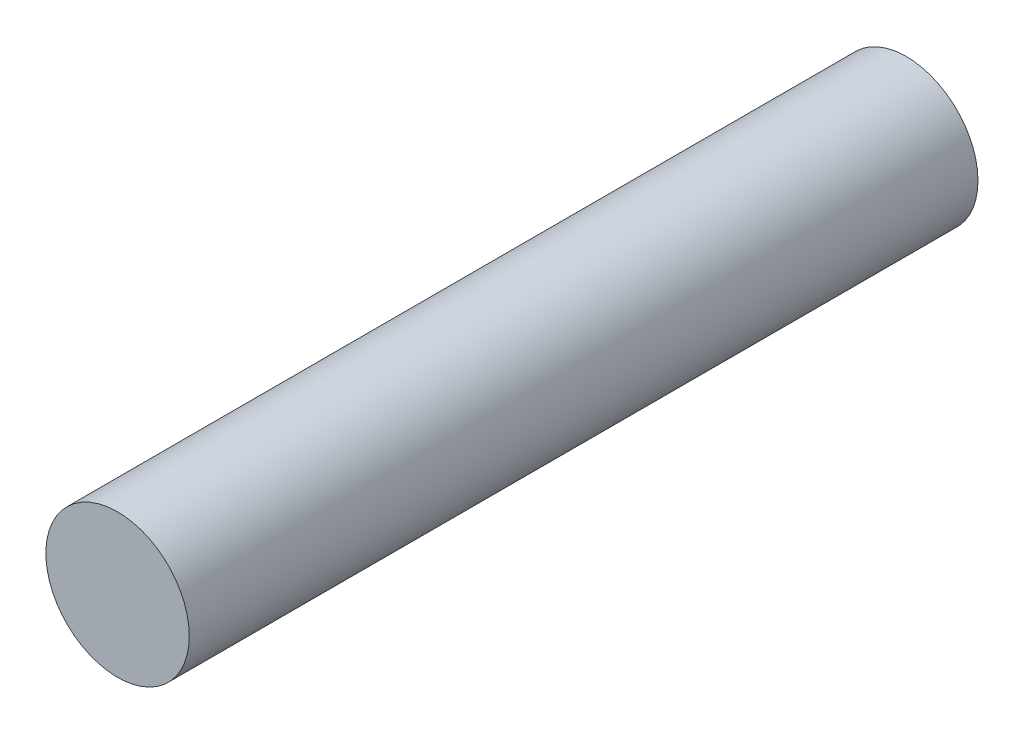
ISO-10303-21;
HEADER;
FILE_DESCRIPTION(('STEP AP214'),'2;1');
FILE_NAME('part.step','',(''),(''),'','','');
FILE_SCHEMA(('AUTOMOTIVE_DESIGN { 1 0 10303 214 1 1 1 1 }'));
ENDSEC;
DATA;
#1=APPLICATION_CONTEXT('core data for automotive mechanical design processes');
#2=APPLICATION_PROTOCOL_DEFINITION('international standard','automotive_design',2000,#1);
#3=PRODUCT_CONTEXT('',#1,'mechanical');
#4=PRODUCT('Part','Part','',(#3));
#5=PRODUCT_RELATED_PRODUCT_CATEGORY('part','',(#4));
#6=PRODUCT_DEFINITION_FORMATION('','',#4);
#7=PRODUCT_DEFINITION_CONTEXT('part definition',#1,'design');
#8=PRODUCT_DEFINITION('design','',#6,#7);
#9=PRODUCT_DEFINITION_SHAPE('','',#8);
#10=(LENGTH_UNIT() NAMED_UNIT(*) SI_UNIT(.MILLI.,.METRE.));
#11=(NAMED_UNIT(*) PLANE_ANGLE_UNIT() SI_UNIT($,.RADIAN.));
#12=(NAMED_UNIT(*) SI_UNIT($,.STERADIAN.) SOLID_ANGLE_UNIT());
#13=UNCERTAINTY_MEASURE_WITH_UNIT(LENGTH_MEASURE(1.E-05),#10,'distance_accuracy_value','');
#14=(GEOMETRIC_REPRESENTATION_CONTEXT(3) GLOBAL_UNCERTAINTY_ASSIGNED_CONTEXT((#13)) GLOBAL_UNIT_ASSIGNED_CONTEXT((#10,
#11,#12)) REPRESENTATION_CONTEXT('',''));
#15=CARTESIAN_POINT('',(0.,0.,0.));
#16=DIRECTION('',(0.,0.,1.));
#17=DIRECTION('',(1.,0.,0.));
#18=AXIS2_PLACEMENT_3D('',#15,#16,#17);
#19=CARTESIAN_POINT('',(-14.5758744408041,3.25883371643993,55.));
#20=DIRECTION('',(0.,0.,-1.));
#21=DIRECTION('',(-1.,0.,0.));
#22=AXIS2_PLACEMENT_3D('',#19,#20,#21);
#23=CYLINDRICAL_SURFACE('',#22,5.);
#24=CARTESIAN_POINT('',(-14.5758744408041,3.25883371643993,55.));
#25=DIRECTION('',(0.,0.,1.));
#26=DIRECTION('',(1.,0.,0.));
#27=AXIS2_PLACEMENT_3D('',#24,#25,#26);
#28=CIRCLE('',#27,5.);
#29=CARTESIAN_POINT('',(-9.57587444080406,3.25883371643993,55.));
#30=VERTEX_POINT('',#29);
#31=EDGE_CURVE('E10',#30,#30,#28,.T.);
#32=ORIENTED_EDGE('',*,*,#31,.F.);
#33=EDGE_LOOP('',(#32));
#34=FACE_BOUND('',#33,.T.);
#35=CARTESIAN_POINT('',(-14.5758744408041,3.25883371643993,0.));
#36=DIRECTION('',(0.,0.,1.));
#37=DIRECTION('',(1.,0.,0.));
#38=AXIS2_PLACEMENT_3D('',#35,#36,#37);
#39=CIRCLE('',#38,5.);
#40=CARTESIAN_POINT('',(-9.57587444080406,3.25883371643993,0.));
#41=VERTEX_POINT('',#40);
#42=EDGE_CURVE('E42',#41,#41,#39,.T.);
#43=ORIENTED_EDGE('',*,*,#42,.T.);
#44=EDGE_LOOP('',(#43));
#45=FACE_BOUND('',#44,.T.);
#46=ADVANCED_FACE('F39',(#34,#45),#23,.T.);
#47=CARTESIAN_POINT('',(-14.5758744408041,3.25883371643993,55.));
#48=DIRECTION('',(0.,0.,1.));
#49=DIRECTION('',(1.,0.,0.));
#50=AXIS2_PLACEMENT_3D('',#47,#48,#49);
#51=PLANE('',#50);
#52=ORIENTED_EDGE('',*,*,#31,.T.);
#53=EDGE_LOOP('',(#52));
#54=FACE_BOUND('',#53,.T.);
#55=ADVANCED_FACE('F56',(#54),#51,.T.);
#56=CARTESIAN_POINT('',(-14.5758744408041,3.25883371643993,0.));
#57=DIRECTION('',(0.,0.,1.));
#58=DIRECTION('',(1.,0.,0.));
#59=AXIS2_PLACEMENT_3D('',#56,#57,#58);
#60=PLANE('',#59);
#61=ORIENTED_EDGE('',*,*,#42,.F.);
#62=EDGE_LOOP('',(#61));
#63=FACE_BOUND('',#62,.T.);
#64=ADVANCED_FACE('F54',(#63),#60,.F.);
#65=CLOSED_SHELL('',(#46,#55,#64));
#66=MANIFOLD_SOLID_BREP('B2',#65);
#67=ADVANCED_BREP_SHAPE_REPRESENTATION('',(#18,#66),#14);
#68=SHAPE_DEFINITION_REPRESENTATION(#9,#67);
ENDSEC;
END-ISO-10303-21;
